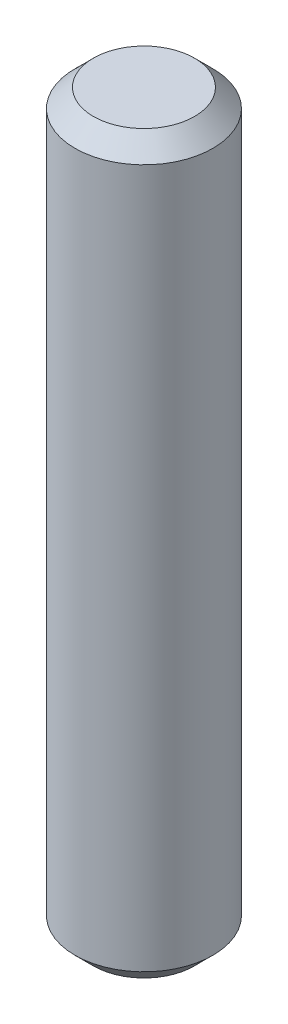
ISO-10303-21;
HEADER;
FILE_DESCRIPTION(('STEP AP214'),'2;1');
FILE_NAME('part.step','',(''),(''),'','','');
FILE_SCHEMA(('AUTOMOTIVE_DESIGN { 1 0 10303 214 1 1 1 1 }'));
ENDSEC;
DATA;
#1=APPLICATION_CONTEXT('core data for automotive mechanical design processes');
#2=APPLICATION_PROTOCOL_DEFINITION('international standard','automotive_design',2000,#1);
#3=PRODUCT_CONTEXT('',#1,'mechanical');
#4=PRODUCT('Part','Part','',(#3));
#5=PRODUCT_RELATED_PRODUCT_CATEGORY('part','',(#4));
#6=PRODUCT_DEFINITION_FORMATION('','',#4);
#7=PRODUCT_DEFINITION_CONTEXT('part definition',#1,'design');
#8=PRODUCT_DEFINITION('design','',#6,#7);
#9=PRODUCT_DEFINITION_SHAPE('','',#8);
#10=(LENGTH_UNIT() NAMED_UNIT(*) SI_UNIT(.MILLI.,.METRE.));
#11=(NAMED_UNIT(*) PLANE_ANGLE_UNIT() SI_UNIT($,.RADIAN.));
#12=(NAMED_UNIT(*) SI_UNIT($,.STERADIAN.) SOLID_ANGLE_UNIT());
#13=UNCERTAINTY_MEASURE_WITH_UNIT(LENGTH_MEASURE(1.E-05),#10,'distance_accuracy_value','');
#14=(GEOMETRIC_REPRESENTATION_CONTEXT(3) GLOBAL_UNCERTAINTY_ASSIGNED_CONTEXT((#13)) GLOBAL_UNIT_ASSIGNED_CONTEXT((#10,
#11,#12)) REPRESENTATION_CONTEXT('',''));
#15=CARTESIAN_POINT('',(0.,0.,0.));
#16=DIRECTION('',(0.,0.,1.));
#17=DIRECTION('',(1.,0.,0.));
#18=AXIS2_PLACEMENT_3D('',#15,#16,#17);
#19=CARTESIAN_POINT('',(0.,8.,0.));
#20=DIRECTION('',(0.,-1.,0.));
#21=DIRECTION('',(0.,0.,-1.));
#22=AXIS2_PLACEMENT_3D('',#19,#20,#21);
#23=CYLINDRICAL_SURFACE('',#22,0.75);
#24=CARTESIAN_POINT('',(0.,0.200000000000001,0.));
#25=DIRECTION('',(0.,1.,0.));
#26=DIRECTION('',(0.,0.,1.));
#27=AXIS2_PLACEMENT_3D('',#24,#25,#26);
#28=CIRCLE('',#27,0.75);
#29=CARTESIAN_POINT('',(0.,0.200000000000001,0.75));
#30=VERTEX_POINT('',#29);
#31=EDGE_CURVE('E59',#30,#30,#28,.T.);
#32=ORIENTED_EDGE('',*,*,#31,.T.);
#33=EDGE_LOOP('',(#32));
#34=FACE_BOUND('',#33,.T.);
#35=CARTESIAN_POINT('',(0.,7.8,0.));
#36=DIRECTION('',(0.,1.,0.));
#37=DIRECTION('',(0.,0.,1.));
#38=AXIS2_PLACEMENT_3D('',#35,#36,#37);
#39=CIRCLE('',#38,0.75);
#40=CARTESIAN_POINT('',(0.,7.8,0.75));
#41=VERTEX_POINT('',#40);
#42=EDGE_CURVE('E64',#41,#41,#39,.F.);
#43=ORIENTED_EDGE('',*,*,#42,.T.);
#44=EDGE_LOOP('',(#43));
#45=FACE_BOUND('',#44,.T.);
#46=ADVANCED_FACE('F45',(#34,#45),#23,.T.);
#47=CARTESIAN_POINT('',(0.,8.,0.));
#48=DIRECTION('',(0.,1.,0.));
#49=DIRECTION('',(0.,0.,1.));
#50=AXIS2_PLACEMENT_3D('',#47,#48,#49);
#51=PLANE('',#50);
#52=CARTESIAN_POINT('',(0.,8.,0.));
#53=DIRECTION('',(0.,1.,0.));
#54=DIRECTION('',(0.,0.,1.));
#55=AXIS2_PLACEMENT_3D('',#52,#53,#54);
#56=CIRCLE('',#55,0.550000000000001);
#57=CARTESIAN_POINT('',(0.,8.,0.550000000000001));
#58=VERTEX_POINT('',#57);
#59=EDGE_CURVE('E10',#58,#58,#56,.T.);
#60=ORIENTED_EDGE('',*,*,#59,.T.);
#61=EDGE_LOOP('',(#60));
#62=FACE_BOUND('',#61,.T.);
#63=ADVANCED_FACE('F81',(#62),#51,.T.);
#64=CARTESIAN_POINT('',(0.,0.,0.));
#65=DIRECTION('',(0.,1.,0.));
#66=DIRECTION('',(0.,0.,1.));
#67=AXIS2_PLACEMENT_3D('',#64,#65,#66);
#68=PLANE('',#67);
#69=CARTESIAN_POINT('',(0.,0.,0.));
#70=DIRECTION('',(0.,1.,0.));
#71=DIRECTION('',(0.,0.,1.));
#72=AXIS2_PLACEMENT_3D('',#69,#70,#71);
#73=CIRCLE('',#72,0.549999999999998);
#74=CARTESIAN_POINT('',(0.,0.,0.549999999999998));
#75=VERTEX_POINT('',#74);
#76=EDGE_CURVE('E54',#75,#75,#73,.F.);
#77=ORIENTED_EDGE('',*,*,#76,.T.);
#78=EDGE_LOOP('',(#77));
#79=FACE_BOUND('',#78,.T.);
#80=ADVANCED_FACE('F78',(#79),#68,.F.);
#81=CARTESIAN_POINT('',(0.,0.200000000000001,0.));
#82=DIRECTION('',(0.,1.,0.));
#83=DIRECTION('',(0.,0.,1.));
#84=AXIS2_PLACEMENT_3D('',#81,#82,#83);
#85=CONICAL_SURFACE('',#84,0.75,0.785398163397451);
#86=ORIENTED_EDGE('',*,*,#76,.F.);
#87=EDGE_LOOP('',(#86));
#88=FACE_BOUND('',#87,.T.);
#89=ORIENTED_EDGE('',*,*,#31,.F.);
#90=EDGE_LOOP('',(#89));
#91=FACE_BOUND('',#90,.T.);
#92=ADVANCED_FACE('F74',(#88,#91),#85,.T.);
#93=CARTESIAN_POINT('',(0.,8.,0.));
#94=DIRECTION('',(0.,-1.,0.));
#95=DIRECTION('',(0.,0.,-1.));
#96=AXIS2_PLACEMENT_3D('',#93,#94,#95);
#97=CONICAL_SURFACE('',#96,0.550000000000001,0.785398163397445);
#98=ORIENTED_EDGE('',*,*,#42,.F.);
#99=EDGE_LOOP('',(#98));
#100=FACE_BOUND('',#99,.T.);
#101=ORIENTED_EDGE('',*,*,#59,.F.);
#102=EDGE_LOOP('',(#101));
#103=FACE_BOUND('',#102,.T.);
#104=ADVANCED_FACE('F48',(#100,#103),#97,.T.);
#105=CLOSED_SHELL('',(#46,#63,#80,#92,#104));
#106=MANIFOLD_SOLID_BREP('B2',#105);
#107=ADVANCED_BREP_SHAPE_REPRESENTATION('',(#18,#106),#14);
#108=SHAPE_DEFINITION_REPRESENTATION(#9,#107);
ENDSEC;
END-ISO-10303-21;
